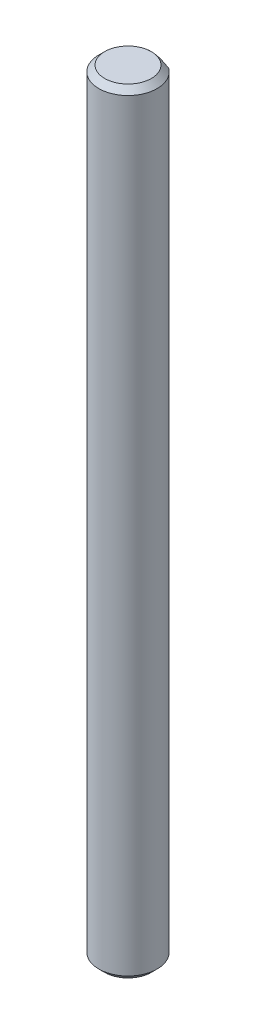
ISO-10303-21;
HEADER;
FILE_DESCRIPTION(('STEP AP214'),'2;1');
FILE_NAME('part.step','',(''),(''),'','','');
FILE_SCHEMA(('AUTOMOTIVE_DESIGN { 1 0 10303 214 1 1 1 1 }'));
ENDSEC;
DATA;
#1=APPLICATION_CONTEXT('core data for automotive mechanical design processes');
#2=APPLICATION_PROTOCOL_DEFINITION('international standard','automotive_design',2000,#1);
#3=PRODUCT_CONTEXT('',#1,'mechanical');
#4=PRODUCT('Part','Part','',(#3));
#5=PRODUCT_RELATED_PRODUCT_CATEGORY('part','',(#4));
#6=PRODUCT_DEFINITION_FORMATION('','',#4);
#7=PRODUCT_DEFINITION_CONTEXT('part definition',#1,'design');
#8=PRODUCT_DEFINITION('design','',#6,#7);
#9=PRODUCT_DEFINITION_SHAPE('','',#8);
#10=(LENGTH_UNIT() NAMED_UNIT(*) SI_UNIT(.MILLI.,.METRE.));
#11=(NAMED_UNIT(*) PLANE_ANGLE_UNIT() SI_UNIT($,.RADIAN.));
#12=(NAMED_UNIT(*) SI_UNIT($,.STERADIAN.) SOLID_ANGLE_UNIT());
#13=UNCERTAINTY_MEASURE_WITH_UNIT(LENGTH_MEASURE(1.E-05),#10,'distance_accuracy_value','');
#14=(GEOMETRIC_REPRESENTATION_CONTEXT(3) GLOBAL_UNCERTAINTY_ASSIGNED_CONTEXT((#13)) GLOBAL_UNIT_ASSIGNED_CONTEXT((#10,
#11,#12)) REPRESENTATION_CONTEXT('',''));
#15=CARTESIAN_POINT('',(0.,0.,0.));
#16=DIRECTION('',(0.,0.,1.));
#17=DIRECTION('',(1.,0.,0.));
#18=AXIS2_PLACEMENT_3D('',#15,#16,#17);
#19=CARTESIAN_POINT('',(0.,-33.2,-2.50000000000001));
#20=DIRECTION('',(0.,1.,0.));
#21=DIRECTION('',(0.,0.,1.));
#22=AXIS2_PLACEMENT_3D('',#19,#20,#21);
#23=PLANE('',#22);
#24=CARTESIAN_POINT('',(0.,-33.2,0.));
#25=DIRECTION('',(0.,1.,0.));
#26=DIRECTION('',(0.,0.,1.));
#27=AXIS2_PLACEMENT_3D('',#24,#25,#26);
#28=CIRCLE('',#27,2.);
#29=CARTESIAN_POINT('',(0.,-33.2,1.99999999999999));
#30=VERTEX_POINT('',#29);
#31=EDGE_CURVE('E96',#30,#30,#28,.F.);
#32=ORIENTED_EDGE('',*,*,#31,.T.);
#33=EDGE_LOOP('',(#32));
#34=FACE_BOUND('',#33,.T.);
#35=ADVANCED_FACE('F38',(#34),#23,.F.);
#36=CARTESIAN_POINT('',(0.,33.2,0.));
#37=DIRECTION('',(0.,1.,0.));
#38=DIRECTION('',(0.,0.,1.));
#39=AXIS2_PLACEMENT_3D('',#36,#37,#38);
#40=CYLINDRICAL_SURFACE('',#39,2.5);
#41=CARTESIAN_POINT('',(0.,-32.7,0.));
#42=DIRECTION('',(0.,1.,0.));
#43=DIRECTION('',(0.,0.,1.));
#44=AXIS2_PLACEMENT_3D('',#41,#42,#43);
#45=CIRCLE('',#44,2.5);
#46=CARTESIAN_POINT('',(0.,-32.7,2.49999999999999));
#47=VERTEX_POINT('',#46);
#48=EDGE_CURVE('E93',#47,#47,#45,.T.);
#49=ORIENTED_EDGE('',*,*,#48,.T.);
#50=EDGE_LOOP('',(#49));
#51=FACE_BOUND('',#50,.T.);
#52=DIRECTION('',(0.,1.,0.));
#53=VECTOR('',#52,1.);
#54=CARTESIAN_POINT('',(1.5,11.2,-2.));
#55=LINE('',#54,#53);
#56=CARTESIAN_POINT('',(1.5,11.2,-2.));
#57=VERTEX_POINT('',#56);
#58=CARTESIAN_POINT('',(1.5,32.7,-1.99999999999999));
#59=VERTEX_POINT('',#58);
#60=EDGE_CURVE('E86',#57,#59,#55,.T.);
#61=ORIENTED_EDGE('',*,*,#60,.T.);
#62=CARTESIAN_POINT('',(0.,32.7,0.));
#63=DIRECTION('',(0.,-1.,0.));
#64=DIRECTION('',(0.,0.,-1.));
#65=AXIS2_PLACEMENT_3D('',#62,#63,#64);
#66=CIRCLE('',#65,2.5);
#67=CARTESIAN_POINT('',(-1.5,32.7,-1.99999999999999));
#68=VERTEX_POINT('',#67);
#69=EDGE_CURVE('E65',#59,#68,#66,.T.);
#70=ORIENTED_EDGE('',*,*,#69,.T.);
#71=DIRECTION('',(0.,1.,0.));
#72=VECTOR('',#71,1.);
#73=CARTESIAN_POINT('',(-1.5,11.2,-2.));
#74=LINE('',#73,#72);
#75=CARTESIAN_POINT('',(-1.5,11.2,-2.));
#76=VERTEX_POINT('',#75);
#77=EDGE_CURVE('E84',#76,#68,#74,.T.);
#78=ORIENTED_EDGE('',*,*,#77,.F.);
#79=CARTESIAN_POINT('',(0.,11.2,0.));
#80=DIRECTION('',(0.,1.,0.));
#81=DIRECTION('',(0.,0.,1.));
#82=AXIS2_PLACEMENT_3D('',#79,#80,#81);
#83=CIRCLE('',#82,2.5);
#84=EDGE_CURVE('E77',#57,#76,#83,.T.);
#85=ORIENTED_EDGE('',*,*,#84,.F.);
#86=EDGE_LOOP('',(#61,#70,#78,#85));
#87=FACE_BOUND('',#86,.T.);
#88=ADVANCED_FACE('F88',(#51,#87),#40,.T.);
#89=CARTESIAN_POINT('',(0.,33.2,0.));
#90=DIRECTION('',(0.,-1.,0.));
#91=DIRECTION('',(0.,0.,-1.));
#92=AXIS2_PLACEMENT_3D('',#89,#90,#91);
#93=PLANE('',#92);
#94=CARTESIAN_POINT('',(0.,33.2,0.));
#95=DIRECTION('',(0.,-1.,0.));
#96=DIRECTION('',(0.,0.,-1.));
#97=AXIS2_PLACEMENT_3D('',#94,#95,#96);
#98=CIRCLE('',#97,1.99999999999999);
#99=CARTESIAN_POINT('',(0.,33.2,-1.99999999999999));
#100=VERTEX_POINT('',#99);
#101=EDGE_CURVE('E99',#100,#100,#98,.F.);
#102=ORIENTED_EDGE('',*,*,#101,.T.);
#103=EDGE_LOOP('',(#102));
#104=FACE_BOUND('',#103,.T.);
#105=ADVANCED_FACE('F109',(#104),#93,.F.);
#106=CARTESIAN_POINT('',(-1.5,11.2,-2.));
#107=DIRECTION('',(0.,0.,1.));
#108=DIRECTION('',(0.,-1.,0.));
#109=AXIS2_PLACEMENT_3D('',#106,#107,#108);
#110=PLANE('',#109);
#111=CARTESIAN_POINT('',(-1.5,32.7,-1.99999999999999));
#112=CARTESIAN_POINT('',(-1.42763018659213,32.7433736980276,-1.99999999999999));
#113=CARTESIAN_POINT('',(-1.35436226532258,32.7853687019536,-1.99999999999999));
#114=CARTESIAN_POINT('',(-1.20549660628809,32.8656443583189,-1.99999999999999));
#115=CARTESIAN_POINT('',(-1.12989157710705,32.9039114197061,-1.99999999999999));
#116=CARTESIAN_POINT('',(-0.97829673487483,32.974534191742,-1.99999999999999));
#117=CARTESIAN_POINT('',(-0.902366736266407,33.0070165390548,-1.99999999999999));
#118=CARTESIAN_POINT('',(-0.748220644904074,33.0658090166989,-1.99999999999999));
#119=CARTESIAN_POINT('',(-0.670007876047706,33.0921276624893,-1.99999999999999));
#120=CARTESIAN_POINT('',(-0.543060600019245,33.1280861032667,-1.99999999999999));
#121=CARTESIAN_POINT('',(-0.495021163503644,33.1401901027996,-1.99999999999999));
#122=CARTESIAN_POINT('',(-0.398260419217583,33.1612794306282,-1.99999999999999));
#123=CARTESIAN_POINT('',(-0.349539198139855,33.1702651517484,-1.99999999999999));
#124=CARTESIAN_POINT('',(-0.250852177401957,33.184927124024,-1.99999999999999));
#125=CARTESIAN_POINT('',(-0.200878654038628,33.1905520018212,-1.99999999999999));
#126=CARTESIAN_POINT('',(-0.100607619276168,33.1981023484677,-1.99999999999999));
#127=CARTESIAN_POINT('',(-0.0503098472705226,33.2000243314446,-1.99999999999999));
#128=CARTESIAN_POINT('',(0.,33.2,-1.99999999999999));
#129=B_SPLINE_CURVE_WITH_KNOTS('',3,(#111,#112,#113,#114,#115,#116,#117,#118,#119,#120,#121,
#122,#123,#124,#125,#126,#127,#128),.UNSPECIFIED.,.F.,.F.,(4,2,2,2,2,2,2,2,4),(0.,
0.253195034695596,0.507281075974287,0.754837752612875,1.00205037282501,1.15058504578388,
1.29910100031797,1.44983263801686,1.600706103947),.UNSPECIFIED.);
#130=EDGE_CURVE('E53',#68,#100,#129,.T.);
#131=ORIENTED_EDGE('',*,*,#130,.T.);
#132=CARTESIAN_POINT('',(0.,33.2,-1.99999999999998));
#133=CARTESIAN_POINT('',(0.0614966481035614,33.2000514930088,-1.99999999999998));
#134=CARTESIAN_POINT('',(0.122961796118778,33.197164788165,-1.99999999999999));
#135=CARTESIAN_POINT('',(0.245274670057056,33.1859212389057,-1.99999999999999));
#136=CARTESIAN_POINT('',(0.306123362775475,33.1775750221521,-1.99999999999999));
#137=CARTESIAN_POINT('',(0.425885509906888,33.1559969816614,-1.99999999999999));
#138=CARTESIAN_POINT('',(0.484814317272306,33.1428488248966,-1.99999999999999));
#139=CARTESIAN_POINT('',(0.601555526074532,33.1122507618696,-1.99999999999999));
#140=CARTESIAN_POINT('',(0.659367456410752,33.0947990813251,-1.99999999999999));
#141=CARTESIAN_POINT('',(0.784576263433311,33.0525702057821,-1.99999999999999));
#142=CARTESIAN_POINT('',(0.851714510760655,33.0270315815753,-1.99999999999999));
#143=CARTESIAN_POINT('',(0.984250024576912,32.9717452055524,-1.99999999999999));
#144=CARTESIAN_POINT('',(1.04964642506795,32.9419954048129,-1.99999999999999));
#145=CARTESIAN_POINT('',(1.18016546542205,32.8784785026746,-1.99999999999999));
#146=CARTESIAN_POINT('',(1.24525271545219,32.8446394298057,-1.99999999999999));
#147=CARTESIAN_POINT('',(1.37378197006118,32.7742160914667,-1.99999999999999));
#148=CARTESIAN_POINT('',(1.43722666174302,32.7376367483736,-1.99999999999999));
#149=CARTESIAN_POINT('',(1.5,32.7,-1.99999999999999));
#150=B_SPLINE_CURVE_WITH_KNOTS('',3,(#132,#133,#134,#135,#136,#137,#138,#139,#140,#141,#142,
#143,#144,#145,#146,#147,#148,#149),.UNSPECIFIED.,.F.,.F.,(4,2,2,2,2,2,2,2,4),(0.,
0.184371949240823,0.368386057907035,0.549336051664289,0.730360773654885,0.945674044871391,
1.16109243790835,1.38109142427279,1.60070428639642),.UNSPECIFIED.);
#151=EDGE_CURVE('E11',#100,#59,#150,.T.);
#152=ORIENTED_EDGE('',*,*,#151,.T.);
#153=ORIENTED_EDGE('',*,*,#60,.F.);
#154=DIRECTION('',(1.,0.,0.));
#155=VECTOR('',#154,1.);
#156=CARTESIAN_POINT('',(-1.5,11.2,-2.));
#157=LINE('',#156,#155);
#158=EDGE_CURVE('E80',#76,#57,#157,.T.);
#159=ORIENTED_EDGE('',*,*,#158,.F.);
#160=ORIENTED_EDGE('',*,*,#77,.T.);
#161=EDGE_LOOP('',(#131,#152,#153,#159,#160));
#162=FACE_BOUND('',#161,.T.);
#163=ADVANCED_FACE('F83',(#162),#110,.F.);
#164=CARTESIAN_POINT('',(0.,11.2,0.));
#165=DIRECTION('',(0.,1.,0.));
#166=DIRECTION('',(0.,0.,1.));
#167=AXIS2_PLACEMENT_3D('',#164,#165,#166);
#168=PLANE('',#167);
#169=ORIENTED_EDGE('',*,*,#84,.T.);
#170=ORIENTED_EDGE('',*,*,#158,.T.);
#171=EDGE_LOOP('',(#169,#170));
#172=FACE_BOUND('',#171,.T.);
#173=ADVANCED_FACE('F79',(#172),#168,.T.);
#174=CARTESIAN_POINT('',(0.,-32.7,0.));
#175=DIRECTION('',(0.,1.,0.));
#176=DIRECTION('',(0.,0.,1.));
#177=AXIS2_PLACEMENT_3D('',#174,#175,#176);
#178=CONICAL_SURFACE('',#177,2.5,0.785398163397447);
#179=ORIENTED_EDGE('',*,*,#31,.F.);
#180=EDGE_LOOP('',(#179));
#181=FACE_BOUND('',#180,.T.);
#182=ORIENTED_EDGE('',*,*,#48,.F.);
#183=EDGE_LOOP('',(#182));
#184=FACE_BOUND('',#183,.T.);
#185=ADVANCED_FACE('F120',(#181,#184),#178,.T.);
#186=CARTESIAN_POINT('',(0.,33.2,0.));
#187=DIRECTION('',(0.,-1.,0.));
#188=DIRECTION('',(0.,0.,-1.));
#189=AXIS2_PLACEMENT_3D('',#186,#187,#188);
#190=CONICAL_SURFACE('',#189,1.99999999999999,0.785398163397445);
#191=ORIENTED_EDGE('',*,*,#130,.F.);
#192=ORIENTED_EDGE('',*,*,#69,.F.);
#193=ORIENTED_EDGE('',*,*,#151,.F.);
#194=ORIENTED_EDGE('',*,*,#101,.F.);
#195=EDGE_LOOP('',(#191,#192,#193,#194));
#196=FACE_BOUND('',#195,.T.);
#197=ADVANCED_FACE('F41',(#196),#190,.T.);
#198=CLOSED_SHELL('',(#35,#88,#105,#163,#173,#185,#197));
#199=MANIFOLD_SOLID_BREP('B2',#198);
#200=ADVANCED_BREP_SHAPE_REPRESENTATION('',(#18,#199),#14);
#201=SHAPE_DEFINITION_REPRESENTATION(#9,#200);
ENDSEC;
END-ISO-10303-21;
